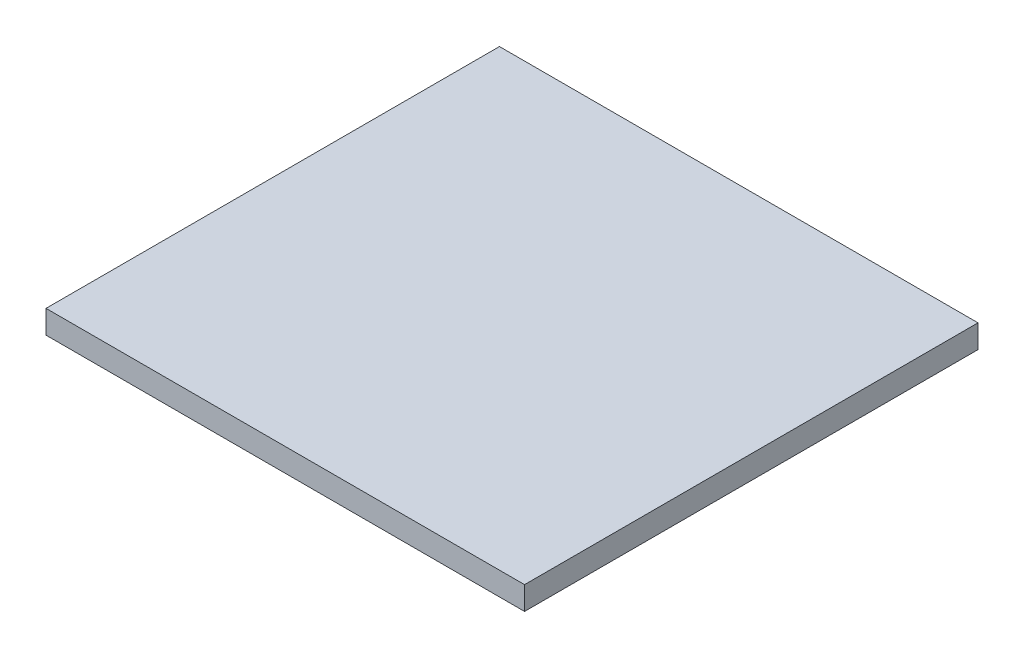
ISO-10303-21;
HEADER;
FILE_DESCRIPTION(('STEP AP214'),'2;1');
FILE_NAME('part.step','',(''),(''),'','','');
FILE_SCHEMA(('AUTOMOTIVE_DESIGN { 1 0 10303 214 1 1 1 1 }'));
ENDSEC;
DATA;
#1=APPLICATION_CONTEXT('core data for automotive mechanical design processes');
#2=APPLICATION_PROTOCOL_DEFINITION('international standard','automotive_design',2000,#1);
#3=PRODUCT_CONTEXT('',#1,'mechanical');
#4=PRODUCT('Part','Part','',(#3));
#5=PRODUCT_RELATED_PRODUCT_CATEGORY('part','',(#4));
#6=PRODUCT_DEFINITION_FORMATION('','',#4);
#7=PRODUCT_DEFINITION_CONTEXT('part definition',#1,'design');
#8=PRODUCT_DEFINITION('design','',#6,#7);
#9=PRODUCT_DEFINITION_SHAPE('','',#8);
#10=(LENGTH_UNIT() NAMED_UNIT(*) SI_UNIT(.MILLI.,.METRE.));
#11=(NAMED_UNIT(*) PLANE_ANGLE_UNIT() SI_UNIT($,.RADIAN.));
#12=(NAMED_UNIT(*) SI_UNIT($,.STERADIAN.) SOLID_ANGLE_UNIT());
#13=UNCERTAINTY_MEASURE_WITH_UNIT(LENGTH_MEASURE(1.E-05),#10,'distance_accuracy_value','');
#14=(GEOMETRIC_REPRESENTATION_CONTEXT(3) GLOBAL_UNCERTAINTY_ASSIGNED_CONTEXT((#13)) GLOBAL_UNIT_ASSIGNED_CONTEXT((#10,
#11,#12)) REPRESENTATION_CONTEXT('',''));
#15=CARTESIAN_POINT('',(0.,0.,0.));
#16=DIRECTION('',(0.,0.,1.));
#17=DIRECTION('',(1.,0.,0.));
#18=AXIS2_PLACEMENT_3D('',#15,#16,#17);
#19=CARTESIAN_POINT('',(-65.9453416149068,6.35,-79.2259130434782));
#20=DIRECTION('',(1.,0.,0.));
#21=DIRECTION('',(0.,0.,-1.));
#22=AXIS2_PLACEMENT_3D('',#19,#20,#21);
#23=PLANE('',#22);
#24=DIRECTION('',(0.,0.,1.));
#25=VECTOR('',#24,1.);
#26=CARTESIAN_POINT('',(-65.9453416149068,0.,-79.2259130434782));
#27=LINE('',#26,#25);
#28=CARTESIAN_POINT('',(-65.9453416149068,0.,-79.2259130434782));
#29=VERTEX_POINT('',#28);
#30=CARTESIAN_POINT('',(-65.9453416149068,0.,44.7260869565218));
#31=VERTEX_POINT('',#30);
#32=EDGE_CURVE('E95',#29,#31,#27,.T.);
#33=ORIENTED_EDGE('',*,*,#32,.T.);
#34=DIRECTION('',(0.,-1.,0.));
#35=VECTOR('',#34,1.);
#36=CARTESIAN_POINT('',(-65.9453416149068,6.35,44.7260869565218));
#37=LINE('',#36,#35);
#38=CARTESIAN_POINT('',(-65.9453416149068,6.35,44.7260869565218));
#39=VERTEX_POINT('',#38);
#40=EDGE_CURVE('E11',#39,#31,#37,.T.);
#41=ORIENTED_EDGE('',*,*,#40,.F.);
#42=DIRECTION('',(0.,0.,1.));
#43=VECTOR('',#42,1.);
#44=CARTESIAN_POINT('',(-65.9453416149068,6.35,-79.2259130434782));
#45=LINE('',#44,#43);
#46=CARTESIAN_POINT('',(-65.9453416149068,6.35,-79.2259130434782));
#47=VERTEX_POINT('',#46);
#48=EDGE_CURVE('E83',#47,#39,#45,.T.);
#49=ORIENTED_EDGE('',*,*,#48,.F.);
#50=DIRECTION('',(0.,-1.,0.));
#51=VECTOR('',#50,1.);
#52=CARTESIAN_POINT('',(-65.9453416149068,6.35,-79.2259130434782));
#53=LINE('',#52,#51);
#54=EDGE_CURVE('E91',#47,#29,#53,.T.);
#55=ORIENTED_EDGE('',*,*,#54,.T.);
#56=EDGE_LOOP('',(#33,#41,#49,#55));
#57=FACE_BOUND('',#56,.T.);
#58=ADVANCED_FACE('F32',(#57),#23,.F.);
#59=CARTESIAN_POINT('',(-65.9453416149068,6.35,44.7260869565218));
#60=DIRECTION('',(0.,0.,-1.));
#61=DIRECTION('',(-1.,0.,0.));
#62=AXIS2_PLACEMENT_3D('',#59,#60,#61);
#63=PLANE('',#62);
#64=DIRECTION('',(1.,0.,0.));
#65=VECTOR('',#64,1.);
#66=CARTESIAN_POINT('',(-65.9453416149068,0.,44.7260869565218));
#67=LINE('',#66,#65);
#68=CARTESIAN_POINT('',(64.8646583850932,0.,44.7260869565218));
#69=VERTEX_POINT('',#68);
#70=EDGE_CURVE('E87',#31,#69,#67,.T.);
#71=ORIENTED_EDGE('',*,*,#70,.T.);
#72=DIRECTION('',(0.,-1.,0.));
#73=VECTOR('',#72,1.);
#74=CARTESIAN_POINT('',(64.8646583850932,6.35,44.7260869565218));
#75=LINE('',#74,#73);
#76=CARTESIAN_POINT('',(64.8646583850932,6.35,44.7260869565218));
#77=VERTEX_POINT('',#76);
#78=EDGE_CURVE('E40',#77,#69,#75,.T.);
#79=ORIENTED_EDGE('',*,*,#78,.F.);
#80=DIRECTION('',(1.,0.,0.));
#81=VECTOR('',#80,1.);
#82=CARTESIAN_POINT('',(-65.9453416149068,6.35,44.7260869565218));
#83=LINE('',#82,#81);
#84=EDGE_CURVE('E78',#39,#77,#83,.T.);
#85=ORIENTED_EDGE('',*,*,#84,.F.);
#86=ORIENTED_EDGE('',*,*,#40,.T.);
#87=EDGE_LOOP('',(#71,#79,#85,#86));
#88=FACE_BOUND('',#87,.T.);
#89=ADVANCED_FACE('F86',(#88),#63,.F.);
#90=CARTESIAN_POINT('',(64.8646583850932,6.35,-79.2259130434782));
#91=DIRECTION('',(-1.,0.,0.));
#92=DIRECTION('',(0.,0.,1.));
#93=AXIS2_PLACEMENT_3D('',#90,#91,#92);
#94=PLANE('',#93);
#95=DIRECTION('',(0.,0.,-1.));
#96=VECTOR('',#95,1.);
#97=CARTESIAN_POINT('',(64.8646583850932,0.,-79.2259130434782));
#98=LINE('',#97,#96);
#99=CARTESIAN_POINT('',(64.8646583850932,0.,-79.2259130434782));
#100=VERTEX_POINT('',#99);
#101=EDGE_CURVE('E65',#69,#100,#98,.T.);
#102=ORIENTED_EDGE('',*,*,#101,.T.);
#103=DIRECTION('',(0.,-1.,0.));
#104=VECTOR('',#103,1.);
#105=CARTESIAN_POINT('',(64.8646583850932,6.35,-79.2259130434782));
#106=LINE('',#105,#104);
#107=CARTESIAN_POINT('',(64.8646583850932,6.35,-79.2259130434782));
#108=VERTEX_POINT('',#107);
#109=EDGE_CURVE('E88',#108,#100,#106,.T.);
#110=ORIENTED_EDGE('',*,*,#109,.F.);
#111=DIRECTION('',(0.,0.,-1.));
#112=VECTOR('',#111,1.);
#113=CARTESIAN_POINT('',(64.8646583850932,6.35,-79.2259130434782));
#114=LINE('',#113,#112);
#115=EDGE_CURVE('E81',#77,#108,#114,.T.);
#116=ORIENTED_EDGE('',*,*,#115,.F.);
#117=ORIENTED_EDGE('',*,*,#78,.T.);
#118=EDGE_LOOP('',(#102,#110,#116,#117));
#119=FACE_BOUND('',#118,.T.);
#120=ADVANCED_FACE('F89',(#119),#94,.F.);
#121=CARTESIAN_POINT('',(-65.9453416149068,6.35,-79.2259130434782));
#122=DIRECTION('',(0.,0.,1.));
#123=DIRECTION('',(1.,0.,0.));
#124=AXIS2_PLACEMENT_3D('',#121,#122,#123);
#125=PLANE('',#124);
#126=DIRECTION('',(-1.,0.,0.));
#127=VECTOR('',#126,1.);
#128=CARTESIAN_POINT('',(-65.9453416149068,0.,-79.2259130434782));
#129=LINE('',#128,#127);
#130=EDGE_CURVE('E71',#100,#29,#129,.T.);
#131=ORIENTED_EDGE('',*,*,#130,.T.);
#132=ORIENTED_EDGE('',*,*,#54,.F.);
#133=DIRECTION('',(-1.,0.,0.));
#134=VECTOR('',#133,1.);
#135=CARTESIAN_POINT('',(-65.9453416149068,6.35,-79.2259130434782));
#136=LINE('',#135,#134);
#137=EDGE_CURVE('E48',#108,#47,#136,.T.);
#138=ORIENTED_EDGE('',*,*,#137,.F.);
#139=ORIENTED_EDGE('',*,*,#109,.T.);
#140=EDGE_LOOP('',(#131,#132,#138,#139));
#141=FACE_BOUND('',#140,.T.);
#142=ADVANCED_FACE('F102',(#141),#125,.F.);
#143=CARTESIAN_POINT('',(0.,6.35,0.));
#144=DIRECTION('',(0.,1.,0.));
#145=DIRECTION('',(0.,0.,1.));
#146=AXIS2_PLACEMENT_3D('',#143,#144,#145);
#147=PLANE('',#146);
#148=ORIENTED_EDGE('',*,*,#48,.T.);
#149=ORIENTED_EDGE('',*,*,#84,.T.);
#150=ORIENTED_EDGE('',*,*,#115,.T.);
#151=ORIENTED_EDGE('',*,*,#137,.T.);
#152=EDGE_LOOP('',(#148,#149,#150,#151));
#153=FACE_BOUND('',#152,.T.);
#154=ADVANCED_FACE('F79',(#153),#147,.T.);
#155=CARTESIAN_POINT('',(0.,0.,0.));
#156=DIRECTION('',(0.,1.,0.));
#157=DIRECTION('',(0.,0.,1.));
#158=AXIS2_PLACEMENT_3D('',#155,#156,#157);
#159=PLANE('',#158);
#160=ORIENTED_EDGE('',*,*,#32,.F.);
#161=ORIENTED_EDGE('',*,*,#130,.F.);
#162=ORIENTED_EDGE('',*,*,#101,.F.);
#163=ORIENTED_EDGE('',*,*,#70,.F.);
#164=EDGE_LOOP('',(#160,#161,#162,#163));
#165=FACE_BOUND('',#164,.T.);
#166=ADVANCED_FACE('F105',(#165),#159,.F.);
#167=CLOSED_SHELL('',(#58,#89,#120,#142,#154,#166));
#168=MANIFOLD_SOLID_BREP('B2',#167);
#169=ADVANCED_BREP_SHAPE_REPRESENTATION('',(#18,#168),#14);
#170=SHAPE_DEFINITION_REPRESENTATION(#9,#169);
ENDSEC;
END-ISO-10303-21;
